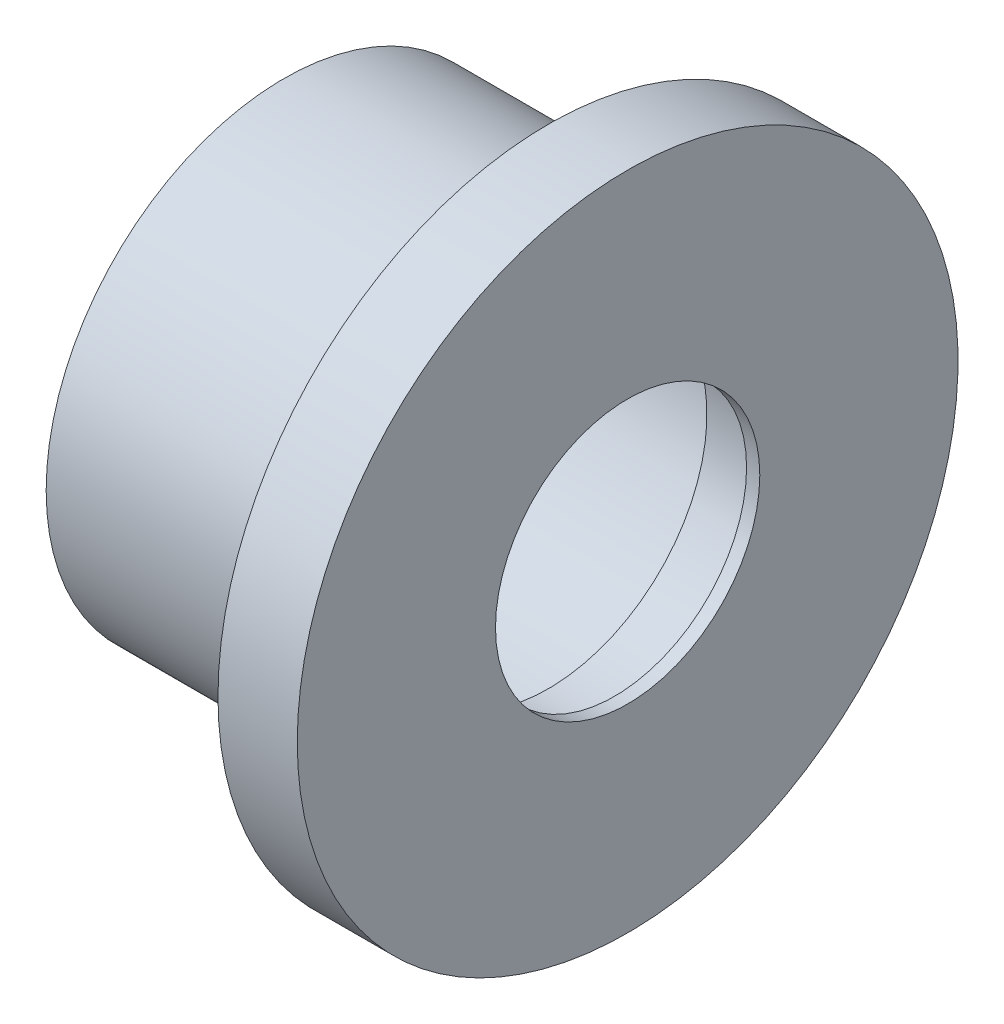
ISO-10303-21;
HEADER;
FILE_DESCRIPTION(('STEP AP214'),'2;1');
FILE_NAME('part.step','',(''),(''),'','','');
FILE_SCHEMA(('AUTOMOTIVE_DESIGN { 1 0 10303 214 1 1 1 1 }'));
ENDSEC;
DATA;
#1=APPLICATION_CONTEXT('core data for automotive mechanical design processes');
#2=APPLICATION_PROTOCOL_DEFINITION('international standard','automotive_design',2000,#1);
#3=PRODUCT_CONTEXT('',#1,'mechanical');
#4=PRODUCT('Part','Part','',(#3));
#5=PRODUCT_RELATED_PRODUCT_CATEGORY('part','',(#4));
#6=PRODUCT_DEFINITION_FORMATION('','',#4);
#7=PRODUCT_DEFINITION_CONTEXT('part definition',#1,'design');
#8=PRODUCT_DEFINITION('design','',#6,#7);
#9=PRODUCT_DEFINITION_SHAPE('','',#8);
#10=(LENGTH_UNIT() NAMED_UNIT(*) SI_UNIT(.MILLI.,.METRE.));
#11=(NAMED_UNIT(*) PLANE_ANGLE_UNIT() SI_UNIT($,.RADIAN.));
#12=(NAMED_UNIT(*) SI_UNIT($,.STERADIAN.) SOLID_ANGLE_UNIT());
#13=UNCERTAINTY_MEASURE_WITH_UNIT(LENGTH_MEASURE(1.E-05),#10,'distance_accuracy_value','');
#14=(GEOMETRIC_REPRESENTATION_CONTEXT(3) GLOBAL_UNCERTAINTY_ASSIGNED_CONTEXT((#13)) GLOBAL_UNIT_ASSIGNED_CONTEXT((#10,
#11,#12)) REPRESENTATION_CONTEXT('',''));
#15=CARTESIAN_POINT('',(0.,0.,0.));
#16=DIRECTION('',(0.,0.,1.));
#17=DIRECTION('',(1.,0.,0.));
#18=AXIS2_PLACEMENT_3D('',#15,#16,#17);
#19=CARTESIAN_POINT('',(-1.,10.,0.));
#20=DIRECTION('',(1.,0.,0.));
#21=DIRECTION('',(0.,0.,-1.));
#22=AXIS2_PLACEMENT_3D('',#19,#20,#21);
#23=PLANE('',#22);
#24=CARTESIAN_POINT('',(-1.,0.,0.));
#25=DIRECTION('',(-1.,0.,0.));
#26=DIRECTION('',(0.,0.,1.));
#27=AXIS2_PLACEMENT_3D('',#24,#25,#26);
#28=CIRCLE('',#27,10.);
#29=CARTESIAN_POINT('',(-1.,0.,10.));
#30=VERTEX_POINT('',#29);
#31=EDGE_CURVE('E10',#30,#30,#28,.T.);
#32=ORIENTED_EDGE('',*,*,#31,.F.);
#33=EDGE_LOOP('',(#32));
#34=FACE_BOUND('',#33,.T.);
#35=CARTESIAN_POINT('',(-1.,0.,0.));
#36=DIRECTION('',(-1.,0.,0.));
#37=DIRECTION('',(0.,0.,1.));
#38=AXIS2_PLACEMENT_3D('',#35,#36,#37);
#39=CIRCLE('',#38,12.);
#40=CARTESIAN_POINT('',(-1.,0.,12.));
#41=VERTEX_POINT('',#40);
#42=EDGE_CURVE('E65',#41,#41,#39,.T.);
#43=ORIENTED_EDGE('',*,*,#42,.T.);
#44=EDGE_LOOP('',(#43));
#45=FACE_BOUND('',#44,.T.);
#46=ADVANCED_FACE('F31',(#34,#45),#23,.F.);
#47=CARTESIAN_POINT('',(-42.8095708761898,0.,0.));
#48=DIRECTION('',(-1.,0.,0.));
#49=DIRECTION('',(0.,0.,1.));
#50=AXIS2_PLACEMENT_3D('',#47,#48,#49);
#51=CYLINDRICAL_SURFACE('',#50,10.);
#52=CARTESIAN_POINT('',(0.,0.,0.));
#53=DIRECTION('',(-1.,0.,0.));
#54=DIRECTION('',(0.,0.,1.));
#55=AXIS2_PLACEMENT_3D('',#52,#53,#54);
#56=CIRCLE('',#55,10.);
#57=CARTESIAN_POINT('',(0.,0.,10.));
#58=VERTEX_POINT('',#57);
#59=EDGE_CURVE('E37',#58,#58,#56,.T.);
#60=ORIENTED_EDGE('',*,*,#59,.F.);
#61=EDGE_LOOP('',(#60));
#62=FACE_BOUND('',#61,.T.);
#63=ORIENTED_EDGE('',*,*,#31,.T.);
#64=EDGE_LOOP('',(#63));
#65=FACE_BOUND('',#64,.T.);
#66=ADVANCED_FACE('F114',(#62,#65),#51,.F.);
#67=CARTESIAN_POINT('',(0.,25.,0.));
#68=DIRECTION('',(-1.,0.,0.));
#69=DIRECTION('',(0.,0.,1.));
#70=AXIS2_PLACEMENT_3D('',#67,#68,#69);
#71=PLANE('',#70);
#72=CARTESIAN_POINT('',(0.,0.,0.));
#73=DIRECTION('',(-1.,0.,0.));
#74=DIRECTION('',(0.,0.,1.));
#75=AXIS2_PLACEMENT_3D('',#72,#73,#74);
#76=CIRCLE('',#75,25.);
#77=CARTESIAN_POINT('',(0.,0.,25.));
#78=VERTEX_POINT('',#77);
#79=EDGE_CURVE('E41',#78,#78,#76,.T.);
#80=ORIENTED_EDGE('',*,*,#79,.F.);
#81=EDGE_LOOP('',(#80));
#82=FACE_BOUND('',#81,.T.);
#83=ORIENTED_EDGE('',*,*,#59,.T.);
#84=EDGE_LOOP('',(#83));
#85=FACE_BOUND('',#84,.T.);
#86=ADVANCED_FACE('F109',(#82,#85),#71,.F.);
#87=CARTESIAN_POINT('',(-42.8095708761898,0.,0.));
#88=DIRECTION('',(-1.,0.,0.));
#89=DIRECTION('',(0.,0.,1.));
#90=AXIS2_PLACEMENT_3D('',#87,#88,#89);
#91=CYLINDRICAL_SURFACE('',#90,25.);
#92=CARTESIAN_POINT('',(-6.00000000000001,0.,0.));
#93=DIRECTION('',(-1.,0.,0.));
#94=DIRECTION('',(0.,0.,1.));
#95=AXIS2_PLACEMENT_3D('',#92,#93,#94);
#96=CIRCLE('',#95,25.);
#97=CARTESIAN_POINT('',(-6.00000000000001,0.,25.));
#98=VERTEX_POINT('',#97);
#99=EDGE_CURVE('E45',#98,#98,#96,.T.);
#100=ORIENTED_EDGE('',*,*,#99,.F.);
#101=EDGE_LOOP('',(#100));
#102=FACE_BOUND('',#101,.T.);
#103=ORIENTED_EDGE('',*,*,#79,.T.);
#104=EDGE_LOOP('',(#103));
#105=FACE_BOUND('',#104,.T.);
#106=ADVANCED_FACE('F103',(#102,#105),#91,.T.);
#107=CARTESIAN_POINT('',(-6.,18.,0.));
#108=DIRECTION('',(1.,0.,0.));
#109=DIRECTION('',(0.,0.,-1.));
#110=AXIS2_PLACEMENT_3D('',#107,#108,#109);
#111=PLANE('',#110);
#112=CARTESIAN_POINT('',(-6.00000000000001,0.,0.));
#113=DIRECTION('',(-1.,0.,0.));
#114=DIRECTION('',(0.,0.,1.));
#115=AXIS2_PLACEMENT_3D('',#112,#113,#114);
#116=CIRCLE('',#115,18.);
#117=CARTESIAN_POINT('',(-6.00000000000001,0.,18.));
#118=VERTEX_POINT('',#117);
#119=EDGE_CURVE('E50',#118,#118,#116,.T.);
#120=ORIENTED_EDGE('',*,*,#119,.F.);
#121=EDGE_LOOP('',(#120));
#122=FACE_BOUND('',#121,.T.);
#123=ORIENTED_EDGE('',*,*,#99,.T.);
#124=EDGE_LOOP('',(#123));
#125=FACE_BOUND('',#124,.T.);
#126=ADVANCED_FACE('F97',(#122,#125),#111,.F.);
#127=CARTESIAN_POINT('',(-42.8095708761898,0.,0.));
#128=DIRECTION('',(-1.,0.,0.));
#129=DIRECTION('',(0.,0.,1.));
#130=AXIS2_PLACEMENT_3D('',#127,#128,#129);
#131=CYLINDRICAL_SURFACE('',#130,18.);
#132=CARTESIAN_POINT('',(-26.,0.,0.));
#133=DIRECTION('',(-1.,0.,0.));
#134=DIRECTION('',(0.,0.,1.));
#135=AXIS2_PLACEMENT_3D('',#132,#133,#134);
#136=CIRCLE('',#135,18.);
#137=CARTESIAN_POINT('',(-26.,0.,18.));
#138=VERTEX_POINT('',#137);
#139=EDGE_CURVE('E53',#138,#138,#136,.T.);
#140=ORIENTED_EDGE('',*,*,#139,.F.);
#141=EDGE_LOOP('',(#140));
#142=FACE_BOUND('',#141,.T.);
#143=ORIENTED_EDGE('',*,*,#119,.T.);
#144=EDGE_LOOP('',(#143));
#145=FACE_BOUND('',#144,.T.);
#146=ADVANCED_FACE('F91',(#142,#145),#131,.T.);
#147=CARTESIAN_POINT('',(-26.,16.,0.));
#148=DIRECTION('',(1.,0.,0.));
#149=DIRECTION('',(0.,0.,-1.));
#150=AXIS2_PLACEMENT_3D('',#147,#148,#149);
#151=PLANE('',#150);
#152=CARTESIAN_POINT('',(-26.,0.,0.));
#153=DIRECTION('',(-1.,0.,0.));
#154=DIRECTION('',(0.,0.,1.));
#155=AXIS2_PLACEMENT_3D('',#152,#153,#154);
#156=CIRCLE('',#155,16.);
#157=CARTESIAN_POINT('',(-26.,0.,16.));
#158=VERTEX_POINT('',#157);
#159=EDGE_CURVE('E56',#158,#158,#156,.T.);
#160=ORIENTED_EDGE('',*,*,#159,.F.);
#161=EDGE_LOOP('',(#160));
#162=FACE_BOUND('',#161,.T.);
#163=ORIENTED_EDGE('',*,*,#139,.T.);
#164=EDGE_LOOP('',(#163));
#165=FACE_BOUND('',#164,.T.);
#166=ADVANCED_FACE('F85',(#162,#165),#151,.F.);
#167=CARTESIAN_POINT('',(-42.8095708761898,0.,0.));
#168=DIRECTION('',(-1.,0.,0.));
#169=DIRECTION('',(0.,0.,1.));
#170=AXIS2_PLACEMENT_3D('',#167,#168,#169);
#171=CYLINDRICAL_SURFACE('',#170,16.);
#172=CARTESIAN_POINT('',(-6.,0.,0.));
#173=DIRECTION('',(-1.,0.,0.));
#174=DIRECTION('',(0.,0.,1.));
#175=AXIS2_PLACEMENT_3D('',#172,#173,#174);
#176=CIRCLE('',#175,16.);
#177=CARTESIAN_POINT('',(-6.,0.,16.));
#178=VERTEX_POINT('',#177);
#179=EDGE_CURVE('E59',#178,#178,#176,.T.);
#180=ORIENTED_EDGE('',*,*,#179,.F.);
#181=EDGE_LOOP('',(#180));
#182=FACE_BOUND('',#181,.T.);
#183=ORIENTED_EDGE('',*,*,#159,.T.);
#184=EDGE_LOOP('',(#183));
#185=FACE_BOUND('',#184,.T.);
#186=ADVANCED_FACE('F79',(#182,#185),#171,.F.);
#187=CARTESIAN_POINT('',(-6.,12.,0.));
#188=DIRECTION('',(1.,0.,0.));
#189=DIRECTION('',(0.,0.,-1.));
#190=AXIS2_PLACEMENT_3D('',#187,#188,#189);
#191=PLANE('',#190);
#192=CARTESIAN_POINT('',(-6.,0.,0.));
#193=DIRECTION('',(-1.,0.,0.));
#194=DIRECTION('',(0.,0.,1.));
#195=AXIS2_PLACEMENT_3D('',#192,#193,#194);
#196=CIRCLE('',#195,12.);
#197=CARTESIAN_POINT('',(-6.,0.,12.));
#198=VERTEX_POINT('',#197);
#199=EDGE_CURVE('E62',#198,#198,#196,.T.);
#200=ORIENTED_EDGE('',*,*,#199,.F.);
#201=EDGE_LOOP('',(#200));
#202=FACE_BOUND('',#201,.T.);
#203=ORIENTED_EDGE('',*,*,#179,.T.);
#204=EDGE_LOOP('',(#203));
#205=FACE_BOUND('',#204,.T.);
#206=ADVANCED_FACE('F73',(#202,#205),#191,.F.);
#207=CARTESIAN_POINT('',(-42.8095708761898,0.,0.));
#208=DIRECTION('',(-1.,0.,0.));
#209=DIRECTION('',(0.,0.,1.));
#210=AXIS2_PLACEMENT_3D('',#207,#208,#209);
#211=CYLINDRICAL_SURFACE('',#210,12.);
#212=ORIENTED_EDGE('',*,*,#42,.F.);
#213=EDGE_LOOP('',(#212));
#214=FACE_BOUND('',#213,.T.);
#215=ORIENTED_EDGE('',*,*,#199,.T.);
#216=EDGE_LOOP('',(#215));
#217=FACE_BOUND('',#216,.T.);
#218=ADVANCED_FACE('F70',(#214,#217),#211,.F.);
#219=CLOSED_SHELL('',(#46,#66,#86,#106,#126,#146,#166,#186,#206,#218));
#220=MANIFOLD_SOLID_BREP('B2',#219);
#221=ADVANCED_BREP_SHAPE_REPRESENTATION('',(#18,#220),#14);
#222=SHAPE_DEFINITION_REPRESENTATION(#9,#221);
ENDSEC;
END-ISO-10303-21;
